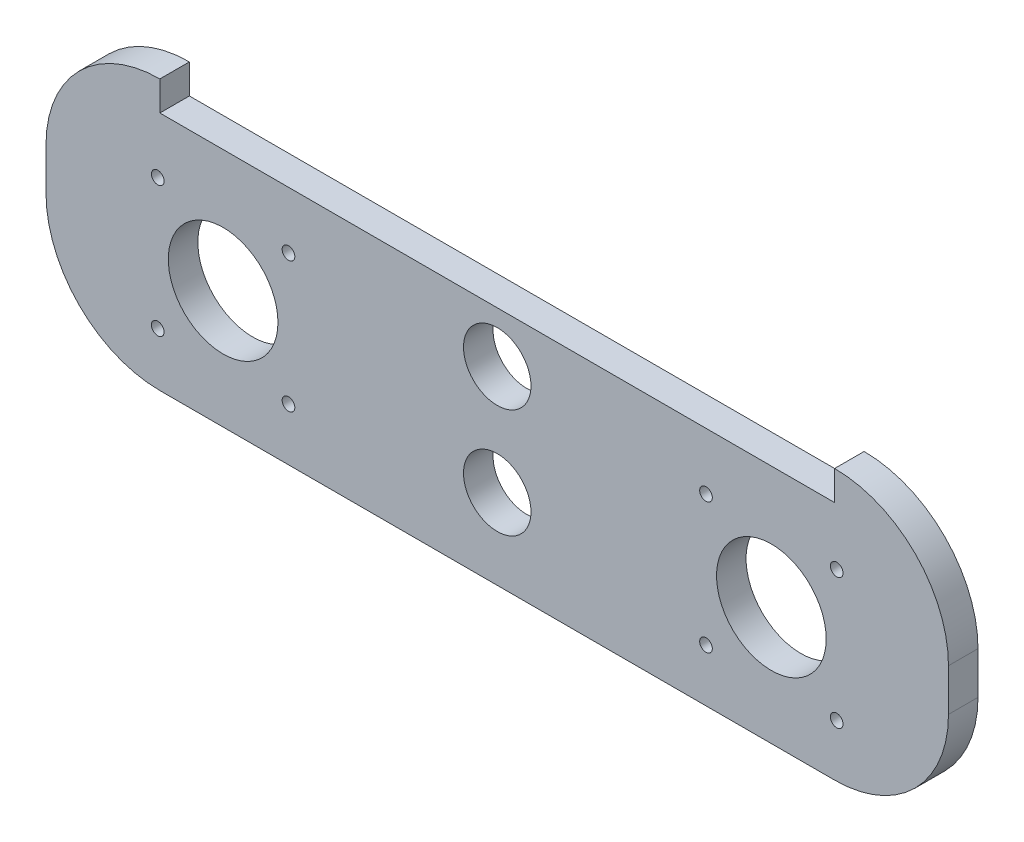
ISO-10303-21;
HEADER;
FILE_DESCRIPTION(('STEP AP214'),'2;1');
FILE_NAME('part.step','',(''),(''),'','','');
FILE_SCHEMA(('AUTOMOTIVE_DESIGN { 1 0 10303 214 1 1 1 1 }'));
ENDSEC;
DATA;
#1=APPLICATION_CONTEXT('core data for automotive mechanical design processes');
#2=APPLICATION_PROTOCOL_DEFINITION('international standard','automotive_design',2000,#1);
#3=PRODUCT_CONTEXT('',#1,'mechanical');
#4=PRODUCT('Part','Part','',(#3));
#5=PRODUCT_RELATED_PRODUCT_CATEGORY('part','',(#4));
#6=PRODUCT_DEFINITION_FORMATION('','',#4);
#7=PRODUCT_DEFINITION_CONTEXT('part definition',#1,'design');
#8=PRODUCT_DEFINITION('design','',#6,#7);
#9=PRODUCT_DEFINITION_SHAPE('','',#8);
#10=(LENGTH_UNIT() NAMED_UNIT(*) SI_UNIT(.MILLI.,.METRE.));
#11=(NAMED_UNIT(*) PLANE_ANGLE_UNIT() SI_UNIT($,.RADIAN.));
#12=(NAMED_UNIT(*) SI_UNIT($,.STERADIAN.) SOLID_ANGLE_UNIT());
#13=UNCERTAINTY_MEASURE_WITH_UNIT(LENGTH_MEASURE(1.E-05),#10,'distance_accuracy_value','');
#14=(GEOMETRIC_REPRESENTATION_CONTEXT(3) GLOBAL_UNCERTAINTY_ASSIGNED_CONTEXT((#13)) GLOBAL_UNIT_ASSIGNED_CONTEXT((#10,
#11,#12)) REPRESENTATION_CONTEXT('',''));
#15=CARTESIAN_POINT('',(0.,0.,0.));
#16=DIRECTION('',(0.,0.,1.));
#17=DIRECTION('',(1.,0.,0.));
#18=AXIS2_PLACEMENT_3D('',#15,#16,#17);
#19=CARTESIAN_POINT('',(-80.,5.00000000000001,7.));
#20=DIRECTION('',(0.,0.,1.));
#21=DIRECTION('',(1.,0.,0.));
#22=AXIS2_PLACEMENT_3D('',#19,#20,#21);
#23=PLANE('',#22);
#24=CARTESIAN_POINT('',(0.,12.9413,7.));
#25=DIRECTION('',(0.,0.,1.));
#26=DIRECTION('',(1.,0.,0.));
#27=AXIS2_PLACEMENT_3D('',#24,#25,#26);
#28=CIRCLE('',#27,8.00000000000001);
#29=CARTESIAN_POINT('',(8.00000000000005,12.9413,7.));
#30=VERTEX_POINT('',#29);
#31=EDGE_CURVE('E321',#30,#30,#28,.T.);
#32=ORIENTED_EDGE('',*,*,#31,.F.);
#33=EDGE_LOOP('',(#32));
#34=FACE_BOUND('',#33,.T.);
#35=CARTESIAN_POINT('',(80.4997806436091,11.4995612872182,7.));
#36=DIRECTION('',(0.,0.,1.));
#37=DIRECTION('',(1.,0.,0.));
#38=AXIS2_PLACEMENT_3D('',#35,#36,#37);
#39=CIRCLE('',#38,1.49999999999998);
#40=CARTESIAN_POINT('',(81.9997806436091,11.4995612872182,7.));
#41=VERTEX_POINT('',#40);
#42=EDGE_CURVE('E305',#41,#41,#39,.T.);
#43=ORIENTED_EDGE('',*,*,#42,.F.);
#44=EDGE_LOOP('',(#43));
#45=FACE_BOUND('',#44,.T.);
#46=CARTESIAN_POINT('',(49.5002193563909,-19.5,7.));
#47=DIRECTION('',(0.,0.,1.));
#48=DIRECTION('',(1.,0.,0.));
#49=AXIS2_PLACEMENT_3D('',#46,#47,#48);
#50=CIRCLE('',#49,1.5);
#51=CARTESIAN_POINT('',(51.0002193563909,-19.5,7.));
#52=VERTEX_POINT('',#51);
#53=EDGE_CURVE('E289',#52,#52,#50,.T.);
#54=ORIENTED_EDGE('',*,*,#53,.F.);
#55=EDGE_LOOP('',(#54));
#56=FACE_BOUND('',#55,.T.);
#57=CARTESIAN_POINT('',(-49.5002193563909,11.4995612872182,7.));
#58=DIRECTION('',(0.,0.,1.));
#59=DIRECTION('',(1.,0.,0.));
#60=AXIS2_PLACEMENT_3D('',#57,#58,#59);
#61=CIRCLE('',#60,1.50000000000001);
#62=CARTESIAN_POINT('',(-48.0002193563909,11.4995612872182,7.));
#63=VERTEX_POINT('',#62);
#64=EDGE_CURVE('E273',#63,#63,#61,.T.);
#65=ORIENTED_EDGE('',*,*,#64,.F.);
#66=EDGE_LOOP('',(#65));
#67=FACE_BOUND('',#66,.T.);
#68=CARTESIAN_POINT('',(-80.4997806436091,-19.5,7.));
#69=DIRECTION('',(0.,0.,1.));
#70=DIRECTION('',(1.,0.,0.));
#71=AXIS2_PLACEMENT_3D('',#68,#69,#70);
#72=CIRCLE('',#71,1.49999999999998);
#73=CARTESIAN_POINT('',(-78.9997806436091,-19.5,7.));
#74=VERTEX_POINT('',#73);
#75=EDGE_CURVE('E257',#74,#74,#72,.T.);
#76=ORIENTED_EDGE('',*,*,#75,.F.);
#77=EDGE_LOOP('',(#76));
#78=FACE_BOUND('',#77,.T.);
#79=CARTESIAN_POINT('',(-65.,-4.00021935639088,7.));
#80=DIRECTION('',(0.,0.,1.));
#81=DIRECTION('',(1.,0.,0.));
#82=AXIS2_PLACEMENT_3D('',#79,#80,#81);
#83=CIRCLE('',#82,13.);
#84=CARTESIAN_POINT('',(-52.,-4.00021935639088,7.));
#85=VERTEX_POINT('',#84);
#86=EDGE_CURVE('E158',#85,#85,#83,.T.);
#87=ORIENTED_EDGE('',*,*,#86,.F.);
#88=EDGE_LOOP('',(#87));
#89=FACE_BOUND('',#88,.T.);
#90=CARTESIAN_POINT('',(-80.,5.00000000000001,7.));
#91=DIRECTION('',(0.,0.,1.));
#92=DIRECTION('',(1.,0.,0.));
#93=AXIS2_PLACEMENT_3D('',#90,#91,#92);
#94=CIRCLE('',#93,27.);
#95=CARTESIAN_POINT('',(-80.,32.,7.));
#96=VERTEX_POINT('',#95);
#97=CARTESIAN_POINT('',(-107.,4.99999999999987,7.));
#98=VERTEX_POINT('',#97);
#99=EDGE_CURVE('E182',#96,#98,#94,.T.);
#100=ORIENTED_EDGE('',*,*,#99,.T.);
#101=DIRECTION('',(0.,-1.,0.));
#102=VECTOR('',#101,1.);
#103=CARTESIAN_POINT('',(-107.,4.99999999999987,7.));
#104=LINE('',#103,#102);
#105=CARTESIAN_POINT('',(-107.,-4.99999999999999,7.));
#106=VERTEX_POINT('',#105);
#107=EDGE_CURVE('E106',#98,#106,#104,.T.);
#108=ORIENTED_EDGE('',*,*,#107,.T.);
#109=CARTESIAN_POINT('',(-80.,-5.,7.));
#110=DIRECTION('',(0.,0.,1.));
#111=DIRECTION('',(1.,0.,0.));
#112=AXIS2_PLACEMENT_3D('',#109,#110,#111);
#113=CIRCLE('',#112,27.);
#114=CARTESIAN_POINT('',(-79.9999999999997,-32.,7.));
#115=VERTEX_POINT('',#114);
#116=EDGE_CURVE('E211',#106,#115,#113,.T.);
#117=ORIENTED_EDGE('',*,*,#116,.T.);
#118=DIRECTION('',(1.,0.,0.));
#119=VECTOR('',#118,1.);
#120=CARTESIAN_POINT('',(-79.9999999999997,-32.,7.));
#121=LINE('',#120,#119);
#122=CARTESIAN_POINT('',(80.,-32.,7.));
#123=VERTEX_POINT('',#122);
#124=EDGE_CURVE('E231',#115,#123,#121,.T.);
#125=ORIENTED_EDGE('',*,*,#124,.T.);
#126=CARTESIAN_POINT('',(80.,-5.00000000000001,7.));
#127=DIRECTION('',(0.,0.,1.));
#128=DIRECTION('',(1.,0.,0.));
#129=AXIS2_PLACEMENT_3D('',#126,#127,#128);
#130=CIRCLE('',#129,27.);
#131=CARTESIAN_POINT('',(107.,-5.00000000000001,7.));
#132=VERTEX_POINT('',#131);
#133=EDGE_CURVE('E227',#123,#132,#130,.T.);
#134=ORIENTED_EDGE('',*,*,#133,.T.);
#135=DIRECTION('',(0.,1.,0.));
#136=VECTOR('',#135,1.);
#137=CARTESIAN_POINT('',(107.,4.9999999999998,7.));
#138=LINE('',#137,#136);
#139=CARTESIAN_POINT('',(107.,4.9999999999998,7.));
#140=VERTEX_POINT('',#139);
#141=EDGE_CURVE('E230',#132,#140,#138,.T.);
#142=ORIENTED_EDGE('',*,*,#141,.T.);
#143=CARTESIAN_POINT('',(79.9999999999998,4.9999999999998,7.));
#144=DIRECTION('',(0.,0.,1.));
#145=DIRECTION('',(1.,0.,0.));
#146=AXIS2_PLACEMENT_3D('',#143,#144,#145);
#147=CIRCLE('',#146,27.0000000000002);
#148=CARTESIAN_POINT('',(79.9999999999999,32.,7.));
#149=VERTEX_POINT('',#148);
#150=EDGE_CURVE('E131',#140,#149,#147,.T.);
#151=ORIENTED_EDGE('',*,*,#150,.T.);
#152=DIRECTION('',(0.,-1.,0.));
#153=VECTOR('',#152,1.);
#154=CARTESIAN_POINT('',(79.9999999999999,25.,7.));
#155=LINE('',#154,#153);
#156=CARTESIAN_POINT('',(79.9999999999999,25.,7.));
#157=VERTEX_POINT('',#156);
#158=EDGE_CURVE('E125',#149,#157,#155,.T.);
#159=ORIENTED_EDGE('',*,*,#158,.T.);
#160=DIRECTION('',(-1.,0.,0.));
#161=VECTOR('',#160,1.);
#162=CARTESIAN_POINT('',(-80.,25.,7.));
#163=LINE('',#162,#161);
#164=CARTESIAN_POINT('',(-80.,25.,7.));
#165=VERTEX_POINT('',#164);
#166=EDGE_CURVE('E129',#157,#165,#163,.T.);
#167=ORIENTED_EDGE('',*,*,#166,.T.);
#168=DIRECTION('',(0.,1.,0.));
#169=VECTOR('',#168,1.);
#170=CARTESIAN_POINT('',(-80.,32.,7.));
#171=LINE('',#170,#169);
#172=EDGE_CURVE('E57',#165,#96,#171,.T.);
#173=ORIENTED_EDGE('',*,*,#172,.T.);
#174=EDGE_LOOP('',(#100,#108,#117,#125,#134,#142,#151,#159,#167,#173));
#175=FACE_BOUND('',#174,.T.);
#176=CARTESIAN_POINT('',(-80.4997806436091,11.4995612872182,7.));
#177=DIRECTION('',(0.,0.,1.));
#178=DIRECTION('',(1.,0.,0.));
#179=AXIS2_PLACEMENT_3D('',#176,#177,#178);
#180=CIRCLE('',#179,1.50000000000001);
#181=CARTESIAN_POINT('',(-78.9997806436091,11.4995612872182,7.));
#182=VERTEX_POINT('',#181);
#183=EDGE_CURVE('E249',#182,#182,#180,.T.);
#184=ORIENTED_EDGE('',*,*,#183,.F.);
#185=EDGE_LOOP('',(#184));
#186=FACE_BOUND('',#185,.T.);
#187=CARTESIAN_POINT('',(-49.5002193563909,-19.5,7.));
#188=DIRECTION('',(0.,0.,1.));
#189=DIRECTION('',(1.,0.,0.));
#190=AXIS2_PLACEMENT_3D('',#187,#188,#189);
#191=CIRCLE('',#190,1.5);
#192=CARTESIAN_POINT('',(-48.0002193563909,-19.5,7.));
#193=VERTEX_POINT('',#192);
#194=EDGE_CURVE('E265',#193,#193,#191,.T.);
#195=ORIENTED_EDGE('',*,*,#194,.F.);
#196=EDGE_LOOP('',(#195));
#197=FACE_BOUND('',#196,.T.);
#198=CARTESIAN_POINT('',(65.,-4.00021935639088,7.));
#199=DIRECTION('',(0.,0.,1.));
#200=DIRECTION('',(1.,0.,0.));
#201=AXIS2_PLACEMENT_3D('',#198,#199,#200);
#202=CIRCLE('',#201,13.);
#203=CARTESIAN_POINT('',(78.,-4.00021935639088,7.));
#204=VERTEX_POINT('',#203);
#205=EDGE_CURVE('E281',#204,#204,#202,.T.);
#206=ORIENTED_EDGE('',*,*,#205,.F.);
#207=EDGE_LOOP('',(#206));
#208=FACE_BOUND('',#207,.T.);
#209=CARTESIAN_POINT('',(80.4997806436091,-19.5,7.));
#210=DIRECTION('',(0.,0.,1.));
#211=DIRECTION('',(1.,0.,0.));
#212=AXIS2_PLACEMENT_3D('',#209,#210,#211);
#213=CIRCLE('',#212,1.5);
#214=CARTESIAN_POINT('',(81.9997806436091,-19.5,7.));
#215=VERTEX_POINT('',#214);
#216=EDGE_CURVE('E297',#215,#215,#213,.T.);
#217=ORIENTED_EDGE('',*,*,#216,.F.);
#218=EDGE_LOOP('',(#217));
#219=FACE_BOUND('',#218,.T.);
#220=CARTESIAN_POINT('',(49.5002193563909,11.4995612872183,7.));
#221=DIRECTION('',(0.,0.,1.));
#222=DIRECTION('',(1.,0.,0.));
#223=AXIS2_PLACEMENT_3D('',#220,#221,#222);
#224=CIRCLE('',#223,1.5);
#225=CARTESIAN_POINT('',(51.0002193563909,11.4995612872183,7.));
#226=VERTEX_POINT('',#225);
#227=EDGE_CURVE('E313',#226,#226,#224,.T.);
#228=ORIENTED_EDGE('',*,*,#227,.F.);
#229=EDGE_LOOP('',(#228));
#230=FACE_BOUND('',#229,.T.);
#231=CARTESIAN_POINT('',(0.,-12.9413,7.));
#232=DIRECTION('',(0.,0.,1.));
#233=DIRECTION('',(1.,0.,0.));
#234=AXIS2_PLACEMENT_3D('',#231,#232,#233);
#235=CIRCLE('',#234,8.00000000000001);
#236=CARTESIAN_POINT('',(8.00000000000005,-12.9413,7.));
#237=VERTEX_POINT('',#236);
#238=EDGE_CURVE('E329',#237,#237,#235,.T.);
#239=ORIENTED_EDGE('',*,*,#238,.F.);
#240=EDGE_LOOP('',(#239));
#241=FACE_BOUND('',#240,.T.);
#242=ADVANCED_FACE('F39',(#34,#45,#56,#67,#78,#89,#175,#186,#197,#208,#219,#230,#241),#23,.T.);
#243=CARTESIAN_POINT('',(-80.,5.00000000000001,0.));
#244=DIRECTION('',(0.,0.,1.));
#245=DIRECTION('',(1.,0.,0.));
#246=AXIS2_PLACEMENT_3D('',#243,#244,#245);
#247=PLANE('',#246);
#248=CARTESIAN_POINT('',(-80.,5.00000000000001,0.));
#249=DIRECTION('',(0.,0.,1.));
#250=DIRECTION('',(1.,0.,0.));
#251=AXIS2_PLACEMENT_3D('',#248,#249,#250);
#252=CIRCLE('',#251,27.);
#253=CARTESIAN_POINT('',(-80.,32.,0.));
#254=VERTEX_POINT('',#253);
#255=CARTESIAN_POINT('',(-107.,4.99999999999987,0.));
#256=VERTEX_POINT('',#255);
#257=EDGE_CURVE('E153',#254,#256,#252,.T.);
#258=ORIENTED_EDGE('',*,*,#257,.F.);
#259=DIRECTION('',(0.,1.,0.));
#260=VECTOR('',#259,1.);
#261=CARTESIAN_POINT('',(-80.,32.,0.));
#262=LINE('',#261,#260);
#263=CARTESIAN_POINT('',(-80.,25.,0.));
#264=VERTEX_POINT('',#263);
#265=EDGE_CURVE('E98',#264,#254,#262,.T.);
#266=ORIENTED_EDGE('',*,*,#265,.F.);
#267=DIRECTION('',(-1.,0.,0.));
#268=VECTOR('',#267,1.);
#269=CARTESIAN_POINT('',(-80.,25.,0.));
#270=LINE('',#269,#268);
#271=CARTESIAN_POINT('',(79.9999999999999,25.,0.));
#272=VERTEX_POINT('',#271);
#273=EDGE_CURVE('E92',#272,#264,#270,.T.);
#274=ORIENTED_EDGE('',*,*,#273,.F.);
#275=DIRECTION('',(0.,-1.,0.));
#276=VECTOR('',#275,1.);
#277=CARTESIAN_POINT('',(79.9999999999999,25.,0.));
#278=LINE('',#277,#276);
#279=CARTESIAN_POINT('',(79.9999999999999,32.,0.));
#280=VERTEX_POINT('',#279);
#281=EDGE_CURVE('E140',#280,#272,#278,.T.);
#282=ORIENTED_EDGE('',*,*,#281,.F.);
#283=CARTESIAN_POINT('',(79.9999999999998,4.9999999999998,0.));
#284=DIRECTION('',(0.,0.,1.));
#285=DIRECTION('',(1.,0.,0.));
#286=AXIS2_PLACEMENT_3D('',#283,#284,#285);
#287=CIRCLE('',#286,27.0000000000002);
#288=CARTESIAN_POINT('',(107.,4.9999999999998,0.));
#289=VERTEX_POINT('',#288);
#290=EDGE_CURVE('E173',#289,#280,#287,.T.);
#291=ORIENTED_EDGE('',*,*,#290,.F.);
#292=DIRECTION('',(0.,1.,0.));
#293=VECTOR('',#292,1.);
#294=CARTESIAN_POINT('',(107.,4.9999999999998,0.));
#295=LINE('',#294,#293);
#296=CARTESIAN_POINT('',(107.,-5.00000000000001,0.));
#297=VERTEX_POINT('',#296);
#298=EDGE_CURVE('E170',#297,#289,#295,.T.);
#299=ORIENTED_EDGE('',*,*,#298,.F.);
#300=CARTESIAN_POINT('',(80.,-5.00000000000001,0.));
#301=DIRECTION('',(0.,0.,1.));
#302=DIRECTION('',(1.,0.,0.));
#303=AXIS2_PLACEMENT_3D('',#300,#301,#302);
#304=CIRCLE('',#303,27.);
#305=CARTESIAN_POINT('',(80.,-32.,0.));
#306=VERTEX_POINT('',#305);
#307=EDGE_CURVE('E167',#306,#297,#304,.T.);
#308=ORIENTED_EDGE('',*,*,#307,.F.);
#309=DIRECTION('',(1.,0.,0.));
#310=VECTOR('',#309,1.);
#311=CARTESIAN_POINT('',(-79.9999999999997,-32.,0.));
#312=LINE('',#311,#310);
#313=CARTESIAN_POINT('',(-79.9999999999997,-32.,0.));
#314=VERTEX_POINT('',#313);
#315=EDGE_CURVE('E164',#314,#306,#312,.T.);
#316=ORIENTED_EDGE('',*,*,#315,.F.);
#317=CARTESIAN_POINT('',(-80.,-5.,0.));
#318=DIRECTION('',(0.,0.,1.));
#319=DIRECTION('',(1.,0.,0.));
#320=AXIS2_PLACEMENT_3D('',#317,#318,#319);
#321=CIRCLE('',#320,27.);
#322=CARTESIAN_POINT('',(-107.,-4.99999999999999,0.));
#323=VERTEX_POINT('',#322);
#324=EDGE_CURVE('E161',#323,#314,#321,.T.);
#325=ORIENTED_EDGE('',*,*,#324,.F.);
#326=DIRECTION('',(0.,-1.,0.));
#327=VECTOR('',#326,1.);
#328=CARTESIAN_POINT('',(-107.,4.99999999999987,0.));
#329=LINE('',#328,#327);
#330=EDGE_CURVE('E157',#256,#323,#329,.T.);
#331=ORIENTED_EDGE('',*,*,#330,.F.);
#332=EDGE_LOOP('',(#258,#266,#274,#282,#291,#299,#308,#316,#325,#331));
#333=FACE_BOUND('',#332,.T.);
#334=CARTESIAN_POINT('',(-65.,-4.00021935639088,0.));
#335=DIRECTION('',(0.,0.,1.));
#336=DIRECTION('',(1.,0.,0.));
#337=AXIS2_PLACEMENT_3D('',#334,#335,#336);
#338=CIRCLE('',#337,13.);
#339=CARTESIAN_POINT('',(-52.,-4.00021935639088,0.));
#340=VERTEX_POINT('',#339);
#341=EDGE_CURVE('E245',#340,#340,#338,.T.);
#342=ORIENTED_EDGE('',*,*,#341,.T.);
#343=EDGE_LOOP('',(#342));
#344=FACE_BOUND('',#343,.T.);
#345=CARTESIAN_POINT('',(-80.4997806436091,11.4995612872182,0.));
#346=DIRECTION('',(0.,0.,1.));
#347=DIRECTION('',(1.,0.,0.));
#348=AXIS2_PLACEMENT_3D('',#345,#346,#347);
#349=CIRCLE('',#348,1.50000000000001);
#350=CARTESIAN_POINT('',(-78.9997806436091,11.4995612872182,0.));
#351=VERTEX_POINT('',#350);
#352=EDGE_CURVE('E253',#351,#351,#349,.T.);
#353=ORIENTED_EDGE('',*,*,#352,.T.);
#354=EDGE_LOOP('',(#353));
#355=FACE_BOUND('',#354,.T.);
#356=CARTESIAN_POINT('',(-80.4997806436091,-19.5,0.));
#357=DIRECTION('',(0.,0.,1.));
#358=DIRECTION('',(1.,0.,0.));
#359=AXIS2_PLACEMENT_3D('',#356,#357,#358);
#360=CIRCLE('',#359,1.49999999999998);
#361=CARTESIAN_POINT('',(-78.9997806436091,-19.5,0.));
#362=VERTEX_POINT('',#361);
#363=EDGE_CURVE('E261',#362,#362,#360,.T.);
#364=ORIENTED_EDGE('',*,*,#363,.T.);
#365=EDGE_LOOP('',(#364));
#366=FACE_BOUND('',#365,.T.);
#367=CARTESIAN_POINT('',(-49.5002193563909,-19.5,0.));
#368=DIRECTION('',(0.,0.,1.));
#369=DIRECTION('',(1.,0.,0.));
#370=AXIS2_PLACEMENT_3D('',#367,#368,#369);
#371=CIRCLE('',#370,1.5);
#372=CARTESIAN_POINT('',(-48.0002193563909,-19.5,0.));
#373=VERTEX_POINT('',#372);
#374=EDGE_CURVE('E269',#373,#373,#371,.T.);
#375=ORIENTED_EDGE('',*,*,#374,.T.);
#376=EDGE_LOOP('',(#375));
#377=FACE_BOUND('',#376,.T.);
#378=CARTESIAN_POINT('',(-49.5002193563909,11.4995612872182,0.));
#379=DIRECTION('',(0.,0.,1.));
#380=DIRECTION('',(1.,0.,0.));
#381=AXIS2_PLACEMENT_3D('',#378,#379,#380);
#382=CIRCLE('',#381,1.50000000000001);
#383=CARTESIAN_POINT('',(-48.0002193563909,11.4995612872182,0.));
#384=VERTEX_POINT('',#383);
#385=EDGE_CURVE('E277',#384,#384,#382,.T.);
#386=ORIENTED_EDGE('',*,*,#385,.T.);
#387=EDGE_LOOP('',(#386));
#388=FACE_BOUND('',#387,.T.);
#389=CARTESIAN_POINT('',(65.,-4.00021935639088,0.));
#390=DIRECTION('',(0.,0.,1.));
#391=DIRECTION('',(1.,0.,0.));
#392=AXIS2_PLACEMENT_3D('',#389,#390,#391);
#393=CIRCLE('',#392,13.);
#394=CARTESIAN_POINT('',(78.,-4.00021935639088,0.));
#395=VERTEX_POINT('',#394);
#396=EDGE_CURVE('E285',#395,#395,#393,.T.);
#397=ORIENTED_EDGE('',*,*,#396,.T.);
#398=EDGE_LOOP('',(#397));
#399=FACE_BOUND('',#398,.T.);
#400=CARTESIAN_POINT('',(49.5002193563909,-19.5,0.));
#401=DIRECTION('',(0.,0.,1.));
#402=DIRECTION('',(1.,0.,0.));
#403=AXIS2_PLACEMENT_3D('',#400,#401,#402);
#404=CIRCLE('',#403,1.5);
#405=CARTESIAN_POINT('',(51.0002193563909,-19.5,0.));
#406=VERTEX_POINT('',#405);
#407=EDGE_CURVE('E293',#406,#406,#404,.T.);
#408=ORIENTED_EDGE('',*,*,#407,.T.);
#409=EDGE_LOOP('',(#408));
#410=FACE_BOUND('',#409,.T.);
#411=CARTESIAN_POINT('',(80.4997806436091,-19.5,0.));
#412=DIRECTION('',(0.,0.,1.));
#413=DIRECTION('',(1.,0.,0.));
#414=AXIS2_PLACEMENT_3D('',#411,#412,#413);
#415=CIRCLE('',#414,1.5);
#416=CARTESIAN_POINT('',(81.9997806436091,-19.5,0.));
#417=VERTEX_POINT('',#416);
#418=EDGE_CURVE('E301',#417,#417,#415,.T.);
#419=ORIENTED_EDGE('',*,*,#418,.T.);
#420=EDGE_LOOP('',(#419));
#421=FACE_BOUND('',#420,.T.);
#422=CARTESIAN_POINT('',(80.4997806436091,11.4995612872182,0.));
#423=DIRECTION('',(0.,0.,1.));
#424=DIRECTION('',(1.,0.,0.));
#425=AXIS2_PLACEMENT_3D('',#422,#423,#424);
#426=CIRCLE('',#425,1.49999999999998);
#427=CARTESIAN_POINT('',(81.9997806436091,11.4995612872182,0.));
#428=VERTEX_POINT('',#427);
#429=EDGE_CURVE('E309',#428,#428,#426,.T.);
#430=ORIENTED_EDGE('',*,*,#429,.T.);
#431=EDGE_LOOP('',(#430));
#432=FACE_BOUND('',#431,.T.);
#433=CARTESIAN_POINT('',(49.5002193563909,11.4995612872183,0.));
#434=DIRECTION('',(0.,0.,1.));
#435=DIRECTION('',(1.,0.,0.));
#436=AXIS2_PLACEMENT_3D('',#433,#434,#435);
#437=CIRCLE('',#436,1.5);
#438=CARTESIAN_POINT('',(51.0002193563909,11.4995612872183,0.));
#439=VERTEX_POINT('',#438);
#440=EDGE_CURVE('E317',#439,#439,#437,.T.);
#441=ORIENTED_EDGE('',*,*,#440,.T.);
#442=EDGE_LOOP('',(#441));
#443=FACE_BOUND('',#442,.T.);
#444=CARTESIAN_POINT('',(0.,12.9413,0.));
#445=DIRECTION('',(0.,0.,1.));
#446=DIRECTION('',(1.,0.,0.));
#447=AXIS2_PLACEMENT_3D('',#444,#445,#446);
#448=CIRCLE('',#447,8.00000000000001);
#449=CARTESIAN_POINT('',(8.00000000000005,12.9413,0.));
#450=VERTEX_POINT('',#449);
#451=EDGE_CURVE('E325',#450,#450,#448,.T.);
#452=ORIENTED_EDGE('',*,*,#451,.T.);
#453=EDGE_LOOP('',(#452));
#454=FACE_BOUND('',#453,.T.);
#455=CARTESIAN_POINT('',(0.,-12.9413,0.));
#456=DIRECTION('',(0.,0.,1.));
#457=DIRECTION('',(1.,0.,0.));
#458=AXIS2_PLACEMENT_3D('',#455,#456,#457);
#459=CIRCLE('',#458,8.00000000000001);
#460=CARTESIAN_POINT('',(8.00000000000005,-12.9413,0.));
#461=VERTEX_POINT('',#460);
#462=EDGE_CURVE('E333',#461,#461,#459,.T.);
#463=ORIENTED_EDGE('',*,*,#462,.T.);
#464=EDGE_LOOP('',(#463));
#465=FACE_BOUND('',#464,.T.);
#466=ADVANCED_FACE('F215',(#333,#344,#355,#366,#377,#388,#399,#410,#421,#432,#443,#454,#465),
#247,.F.);
#467=CARTESIAN_POINT('',(-80.,5.00000000000001,7.));
#468=DIRECTION('',(0.,0.,-1.));
#469=DIRECTION('',(-1.,0.,0.));
#470=AXIS2_PLACEMENT_3D('',#467,#468,#469);
#471=CYLINDRICAL_SURFACE('',#470,27.);
#472=ORIENTED_EDGE('',*,*,#257,.T.);
#473=DIRECTION('',(0.,0.,-1.));
#474=VECTOR('',#473,1.);
#475=CARTESIAN_POINT('',(-107.,4.99999999999987,7.));
#476=LINE('',#475,#474);
#477=EDGE_CURVE('E11',#98,#256,#476,.T.);
#478=ORIENTED_EDGE('',*,*,#477,.F.);
#479=ORIENTED_EDGE('',*,*,#99,.F.);
#480=DIRECTION('',(0.,0.,-1.));
#481=VECTOR('',#480,1.);
#482=CARTESIAN_POINT('',(-80.,32.,7.));
#483=LINE('',#482,#481);
#484=EDGE_CURVE('E149',#96,#254,#483,.T.);
#485=ORIENTED_EDGE('',*,*,#484,.T.);
#486=EDGE_LOOP('',(#472,#478,#479,#485));
#487=FACE_BOUND('',#486,.T.);
#488=ADVANCED_FACE('F41',(#487),#471,.T.);
#489=CARTESIAN_POINT('',(-107.,4.99999999999987,7.));
#490=DIRECTION('',(1.,0.,0.));
#491=DIRECTION('',(0.,0.,-1.));
#492=AXIS2_PLACEMENT_3D('',#489,#490,#491);
#493=PLANE('',#492);
#494=ORIENTED_EDGE('',*,*,#330,.T.);
#495=DIRECTION('',(0.,0.,-1.));
#496=VECTOR('',#495,1.);
#497=CARTESIAN_POINT('',(-107.,-4.99999999999999,7.));
#498=LINE('',#497,#496);
#499=EDGE_CURVE('E49',#106,#323,#498,.T.);
#500=ORIENTED_EDGE('',*,*,#499,.F.);
#501=ORIENTED_EDGE('',*,*,#107,.F.);
#502=ORIENTED_EDGE('',*,*,#477,.T.);
#503=EDGE_LOOP('',(#494,#500,#501,#502));
#504=FACE_BOUND('',#503,.T.);
#505=ADVANCED_FACE('F377',(#504),#493,.F.);
#506=CARTESIAN_POINT('',(-80.,-5.,7.));
#507=DIRECTION('',(0.,0.,-1.));
#508=DIRECTION('',(-1.,0.,0.));
#509=AXIS2_PLACEMENT_3D('',#506,#507,#508);
#510=CYLINDRICAL_SURFACE('',#509,27.);
#511=ORIENTED_EDGE('',*,*,#324,.T.);
#512=DIRECTION('',(0.,0.,-1.));
#513=VECTOR('',#512,1.);
#514=CARTESIAN_POINT('',(-79.9999999999997,-32.,7.));
#515=LINE('',#514,#513);
#516=EDGE_CURVE('E201',#115,#314,#515,.T.);
#517=ORIENTED_EDGE('',*,*,#516,.F.);
#518=ORIENTED_EDGE('',*,*,#116,.F.);
#519=ORIENTED_EDGE('',*,*,#499,.T.);
#520=EDGE_LOOP('',(#511,#517,#518,#519));
#521=FACE_BOUND('',#520,.T.);
#522=ADVANCED_FACE('F209',(#521),#510,.T.);
#523=CARTESIAN_POINT('',(-79.9999999999997,-32.,7.));
#524=DIRECTION('',(0.,1.,0.));
#525=DIRECTION('',(-1.,0.,0.));
#526=AXIS2_PLACEMENT_3D('',#523,#524,#525);
#527=PLANE('',#526);
#528=ORIENTED_EDGE('',*,*,#315,.T.);
#529=DIRECTION('',(0.,0.,-1.));
#530=VECTOR('',#529,1.);
#531=CARTESIAN_POINT('',(80.,-32.,7.));
#532=LINE('',#531,#530);
#533=EDGE_CURVE('E197',#123,#306,#532,.T.);
#534=ORIENTED_EDGE('',*,*,#533,.F.);
#535=ORIENTED_EDGE('',*,*,#124,.F.);
#536=ORIENTED_EDGE('',*,*,#516,.T.);
#537=EDGE_LOOP('',(#528,#534,#535,#536));
#538=FACE_BOUND('',#537,.T.);
#539=ADVANCED_FACE('F221',(#538),#527,.F.);
#540=CARTESIAN_POINT('',(80.,-5.00000000000001,7.));
#541=DIRECTION('',(0.,0.,-1.));
#542=DIRECTION('',(-1.,0.,0.));
#543=AXIS2_PLACEMENT_3D('',#540,#541,#542);
#544=CYLINDRICAL_SURFACE('',#543,27.);
#545=ORIENTED_EDGE('',*,*,#307,.T.);
#546=DIRECTION('',(0.,0.,-1.));
#547=VECTOR('',#546,1.);
#548=CARTESIAN_POINT('',(107.,-5.00000000000001,7.));
#549=LINE('',#548,#547);
#550=EDGE_CURVE('E193',#132,#297,#549,.T.);
#551=ORIENTED_EDGE('',*,*,#550,.F.);
#552=ORIENTED_EDGE('',*,*,#133,.F.);
#553=ORIENTED_EDGE('',*,*,#533,.T.);
#554=EDGE_LOOP('',(#545,#551,#552,#553));
#555=FACE_BOUND('',#554,.T.);
#556=ADVANCED_FACE('F225',(#555),#544,.T.);
#557=CARTESIAN_POINT('',(107.,4.9999999999998,7.));
#558=DIRECTION('',(-1.,0.,0.));
#559=DIRECTION('',(0.,0.,1.));
#560=AXIS2_PLACEMENT_3D('',#557,#558,#559);
#561=PLANE('',#560);
#562=ORIENTED_EDGE('',*,*,#298,.T.);
#563=DIRECTION('',(0.,0.,-1.));
#564=VECTOR('',#563,1.);
#565=CARTESIAN_POINT('',(107.,4.9999999999998,7.));
#566=LINE('',#565,#564);
#567=EDGE_CURVE('E189',#140,#289,#566,.T.);
#568=ORIENTED_EDGE('',*,*,#567,.F.);
#569=ORIENTED_EDGE('',*,*,#141,.F.);
#570=ORIENTED_EDGE('',*,*,#550,.T.);
#571=EDGE_LOOP('',(#562,#568,#569,#570));
#572=FACE_BOUND('',#571,.T.);
#573=ADVANCED_FACE('F367',(#572),#561,.F.);
#574=CARTESIAN_POINT('',(79.9999999999998,4.9999999999998,7.));
#575=DIRECTION('',(0.,0.,-1.));
#576=DIRECTION('',(-1.,0.,0.));
#577=AXIS2_PLACEMENT_3D('',#574,#575,#576);
#578=CYLINDRICAL_SURFACE('',#577,27.0000000000002);
#579=ORIENTED_EDGE('',*,*,#290,.T.);
#580=DIRECTION('',(0.,0.,-1.));
#581=VECTOR('',#580,1.);
#582=CARTESIAN_POINT('',(79.9999999999999,32.,7.));
#583=LINE('',#582,#581);
#584=EDGE_CURVE('E142',#149,#280,#583,.T.);
#585=ORIENTED_EDGE('',*,*,#584,.F.);
#586=ORIENTED_EDGE('',*,*,#150,.F.);
#587=ORIENTED_EDGE('',*,*,#567,.T.);
#588=EDGE_LOOP('',(#579,#585,#586,#587));
#589=FACE_BOUND('',#588,.T.);
#590=ADVANCED_FACE('F364',(#589),#578,.T.);
#591=CARTESIAN_POINT('',(79.9999999999999,25.,7.));
#592=DIRECTION('',(1.,0.,0.));
#593=DIRECTION('',(0.,0.,-1.));
#594=AXIS2_PLACEMENT_3D('',#591,#592,#593);
#595=PLANE('',#594);
#596=ORIENTED_EDGE('',*,*,#281,.T.);
#597=DIRECTION('',(0.,0.,-1.));
#598=VECTOR('',#597,1.);
#599=CARTESIAN_POINT('',(79.9999999999999,25.,7.));
#600=LINE('',#599,#598);
#601=EDGE_CURVE('E137',#157,#272,#600,.T.);
#602=ORIENTED_EDGE('',*,*,#601,.F.);
#603=ORIENTED_EDGE('',*,*,#158,.F.);
#604=ORIENTED_EDGE('',*,*,#584,.T.);
#605=EDGE_LOOP('',(#596,#602,#603,#604));
#606=FACE_BOUND('',#605,.T.);
#607=ADVANCED_FACE('F138',(#606),#595,.F.);
#608=CARTESIAN_POINT('',(-80.,25.,7.));
#609=DIRECTION('',(0.,-1.,0.));
#610=DIRECTION('',(0.,0.,-1.));
#611=AXIS2_PLACEMENT_3D('',#608,#609,#610);
#612=PLANE('',#611);
#613=ORIENTED_EDGE('',*,*,#273,.T.);
#614=DIRECTION('',(0.,0.,-1.));
#615=VECTOR('',#614,1.);
#616=CARTESIAN_POINT('',(-80.,25.,7.));
#617=LINE('',#616,#615);
#618=EDGE_CURVE('E143',#165,#264,#617,.T.);
#619=ORIENTED_EDGE('',*,*,#618,.F.);
#620=ORIENTED_EDGE('',*,*,#166,.F.);
#621=ORIENTED_EDGE('',*,*,#601,.T.);
#622=EDGE_LOOP('',(#613,#619,#620,#621));
#623=FACE_BOUND('',#622,.T.);
#624=ADVANCED_FACE('F145',(#623),#612,.F.);
#625=CARTESIAN_POINT('',(-80.,32.,7.));
#626=DIRECTION('',(-1.,0.,0.));
#627=DIRECTION('',(0.,0.,1.));
#628=AXIS2_PLACEMENT_3D('',#625,#626,#627);
#629=PLANE('',#628);
#630=ORIENTED_EDGE('',*,*,#265,.T.);
#631=ORIENTED_EDGE('',*,*,#484,.F.);
#632=ORIENTED_EDGE('',*,*,#172,.F.);
#633=ORIENTED_EDGE('',*,*,#618,.T.);
#634=EDGE_LOOP('',(#630,#631,#632,#633));
#635=FACE_BOUND('',#634,.T.);
#636=ADVANCED_FACE('F357',(#635),#629,.F.);
#637=CARTESIAN_POINT('',(-65.,-4.00021935639088,7.));
#638=DIRECTION('',(0.,0.,-1.));
#639=DIRECTION('',(-1.,0.,0.));
#640=AXIS2_PLACEMENT_3D('',#637,#638,#639);
#641=CYLINDRICAL_SURFACE('',#640,13.);
#642=ORIENTED_EDGE('',*,*,#86,.T.);
#643=EDGE_LOOP('',(#642));
#644=FACE_BOUND('',#643,.T.);
#645=ORIENTED_EDGE('',*,*,#341,.F.);
#646=EDGE_LOOP('',(#645));
#647=FACE_BOUND('',#646,.T.);
#648=ADVANCED_FACE('F354',(#644,#647),#641,.F.);
#649=CARTESIAN_POINT('',(-80.4997806436091,11.4995612872182,7.));
#650=DIRECTION('',(0.,0.,-1.));
#651=DIRECTION('',(-1.,0.,0.));
#652=AXIS2_PLACEMENT_3D('',#649,#650,#651);
#653=CYLINDRICAL_SURFACE('',#652,1.50000000000001);
#654=ORIENTED_EDGE('',*,*,#183,.T.);
#655=EDGE_LOOP('',(#654));
#656=FACE_BOUND('',#655,.T.);
#657=ORIENTED_EDGE('',*,*,#352,.F.);
#658=EDGE_LOOP('',(#657));
#659=FACE_BOUND('',#658,.T.);
#660=ADVANCED_FACE('F453',(#656,#659),#653,.F.);
#661=CARTESIAN_POINT('',(-80.4997806436091,-19.5,7.));
#662=DIRECTION('',(0.,0.,-1.));
#663=DIRECTION('',(-1.,0.,0.));
#664=AXIS2_PLACEMENT_3D('',#661,#662,#663);
#665=CYLINDRICAL_SURFACE('',#664,1.49999999999998);
#666=ORIENTED_EDGE('',*,*,#75,.T.);
#667=EDGE_LOOP('',(#666));
#668=FACE_BOUND('',#667,.T.);
#669=ORIENTED_EDGE('',*,*,#363,.F.);
#670=EDGE_LOOP('',(#669));
#671=FACE_BOUND('',#670,.T.);
#672=ADVANCED_FACE('F461',(#668,#671),#665,.F.);
#673=CARTESIAN_POINT('',(-49.5002193563909,-19.5,7.));
#674=DIRECTION('',(0.,0.,-1.));
#675=DIRECTION('',(-1.,0.,0.));
#676=AXIS2_PLACEMENT_3D('',#673,#674,#675);
#677=CYLINDRICAL_SURFACE('',#676,1.5);
#678=ORIENTED_EDGE('',*,*,#194,.T.);
#679=EDGE_LOOP('',(#678));
#680=FACE_BOUND('',#679,.T.);
#681=ORIENTED_EDGE('',*,*,#374,.F.);
#682=EDGE_LOOP('',(#681));
#683=FACE_BOUND('',#682,.T.);
#684=ADVANCED_FACE('F469',(#680,#683),#677,.F.);
#685=CARTESIAN_POINT('',(-49.5002193563909,11.4995612872182,7.));
#686=DIRECTION('',(0.,0.,-1.));
#687=DIRECTION('',(-1.,0.,0.));
#688=AXIS2_PLACEMENT_3D('',#685,#686,#687);
#689=CYLINDRICAL_SURFACE('',#688,1.50000000000001);
#690=ORIENTED_EDGE('',*,*,#64,.T.);
#691=EDGE_LOOP('',(#690));
#692=FACE_BOUND('',#691,.T.);
#693=ORIENTED_EDGE('',*,*,#385,.F.);
#694=EDGE_LOOP('',(#693));
#695=FACE_BOUND('',#694,.T.);
#696=ADVANCED_FACE('F478',(#692,#695),#689,.F.);
#697=CARTESIAN_POINT('',(65.,-4.00021935639088,7.));
#698=DIRECTION('',(0.,0.,-1.));
#699=DIRECTION('',(-1.,0.,0.));
#700=AXIS2_PLACEMENT_3D('',#697,#698,#699);
#701=CYLINDRICAL_SURFACE('',#700,13.);
#702=ORIENTED_EDGE('',*,*,#205,.T.);
#703=EDGE_LOOP('',(#702));
#704=FACE_BOUND('',#703,.T.);
#705=ORIENTED_EDGE('',*,*,#396,.F.);
#706=EDGE_LOOP('',(#705));
#707=FACE_BOUND('',#706,.T.);
#708=ADVANCED_FACE('F487',(#704,#707),#701,.F.);
#709=CARTESIAN_POINT('',(49.5002193563909,-19.5,7.));
#710=DIRECTION('',(0.,0.,-1.));
#711=DIRECTION('',(-1.,0.,0.));
#712=AXIS2_PLACEMENT_3D('',#709,#710,#711);
#713=CYLINDRICAL_SURFACE('',#712,1.5);
#714=ORIENTED_EDGE('',*,*,#53,.T.);
#715=EDGE_LOOP('',(#714));
#716=FACE_BOUND('',#715,.T.);
#717=ORIENTED_EDGE('',*,*,#407,.F.);
#718=EDGE_LOOP('',(#717));
#719=FACE_BOUND('',#718,.T.);
#720=ADVANCED_FACE('F496',(#716,#719),#713,.F.);
#721=CARTESIAN_POINT('',(80.4997806436091,-19.5,7.));
#722=DIRECTION('',(0.,0.,-1.));
#723=DIRECTION('',(-1.,0.,0.));
#724=AXIS2_PLACEMENT_3D('',#721,#722,#723);
#725=CYLINDRICAL_SURFACE('',#724,1.5);
#726=ORIENTED_EDGE('',*,*,#216,.T.);
#727=EDGE_LOOP('',(#726));
#728=FACE_BOUND('',#727,.T.);
#729=ORIENTED_EDGE('',*,*,#418,.F.);
#730=EDGE_LOOP('',(#729));
#731=FACE_BOUND('',#730,.T.);
#732=ADVANCED_FACE('F505',(#728,#731),#725,.F.);
#733=CARTESIAN_POINT('',(80.4997806436091,11.4995612872182,7.));
#734=DIRECTION('',(0.,0.,-1.));
#735=DIRECTION('',(-1.,0.,0.));
#736=AXIS2_PLACEMENT_3D('',#733,#734,#735);
#737=CYLINDRICAL_SURFACE('',#736,1.49999999999998);
#738=ORIENTED_EDGE('',*,*,#42,.T.);
#739=EDGE_LOOP('',(#738));
#740=FACE_BOUND('',#739,.T.);
#741=ORIENTED_EDGE('',*,*,#429,.F.);
#742=EDGE_LOOP('',(#741));
#743=FACE_BOUND('',#742,.T.);
#744=ADVANCED_FACE('F514',(#740,#743),#737,.F.);
#745=CARTESIAN_POINT('',(49.5002193563909,11.4995612872183,7.));
#746=DIRECTION('',(0.,0.,-1.));
#747=DIRECTION('',(-1.,0.,0.));
#748=AXIS2_PLACEMENT_3D('',#745,#746,#747);
#749=CYLINDRICAL_SURFACE('',#748,1.5);
#750=ORIENTED_EDGE('',*,*,#227,.T.);
#751=EDGE_LOOP('',(#750));
#752=FACE_BOUND('',#751,.T.);
#753=ORIENTED_EDGE('',*,*,#440,.F.);
#754=EDGE_LOOP('',(#753));
#755=FACE_BOUND('',#754,.T.);
#756=ADVANCED_FACE('F523',(#752,#755),#749,.F.);
#757=CARTESIAN_POINT('',(0.,12.9413,7.));
#758=DIRECTION('',(0.,0.,-1.));
#759=DIRECTION('',(-1.,0.,0.));
#760=AXIS2_PLACEMENT_3D('',#757,#758,#759);
#761=CYLINDRICAL_SURFACE('',#760,8.00000000000001);
#762=ORIENTED_EDGE('',*,*,#31,.T.);
#763=EDGE_LOOP('',(#762));
#764=FACE_BOUND('',#763,.T.);
#765=ORIENTED_EDGE('',*,*,#451,.F.);
#766=EDGE_LOOP('',(#765));
#767=FACE_BOUND('',#766,.T.);
#768=ADVANCED_FACE('F532',(#764,#767),#761,.F.);
#769=CARTESIAN_POINT('',(0.,-12.9413,7.));
#770=DIRECTION('',(0.,0.,-1.));
#771=DIRECTION('',(-1.,0.,0.));
#772=AXIS2_PLACEMENT_3D('',#769,#770,#771);
#773=CYLINDRICAL_SURFACE('',#772,8.00000000000001);
#774=ORIENTED_EDGE('',*,*,#238,.T.);
#775=EDGE_LOOP('',(#774));
#776=FACE_BOUND('',#775,.T.);
#777=ORIENTED_EDGE('',*,*,#462,.F.);
#778=EDGE_LOOP('',(#777));
#779=FACE_BOUND('',#778,.T.);
#780=ADVANCED_FACE('F341',(#776,#779),#773,.F.);
#781=CLOSED_SHELL('',(#242,#466,#488,#505,#522,#539,#556,#573,#590,#607,#624,#636,#648,#660,
#672,#684,#696,#708,#720,#732,#744,#756,#768,#780));
#782=MANIFOLD_SOLID_BREP('B2',#781);
#783=ADVANCED_BREP_SHAPE_REPRESENTATION('',(#18,#782),#14);
#784=SHAPE_DEFINITION_REPRESENTATION(#9,#783);
ENDSEC;
END-ISO-10303-21;
